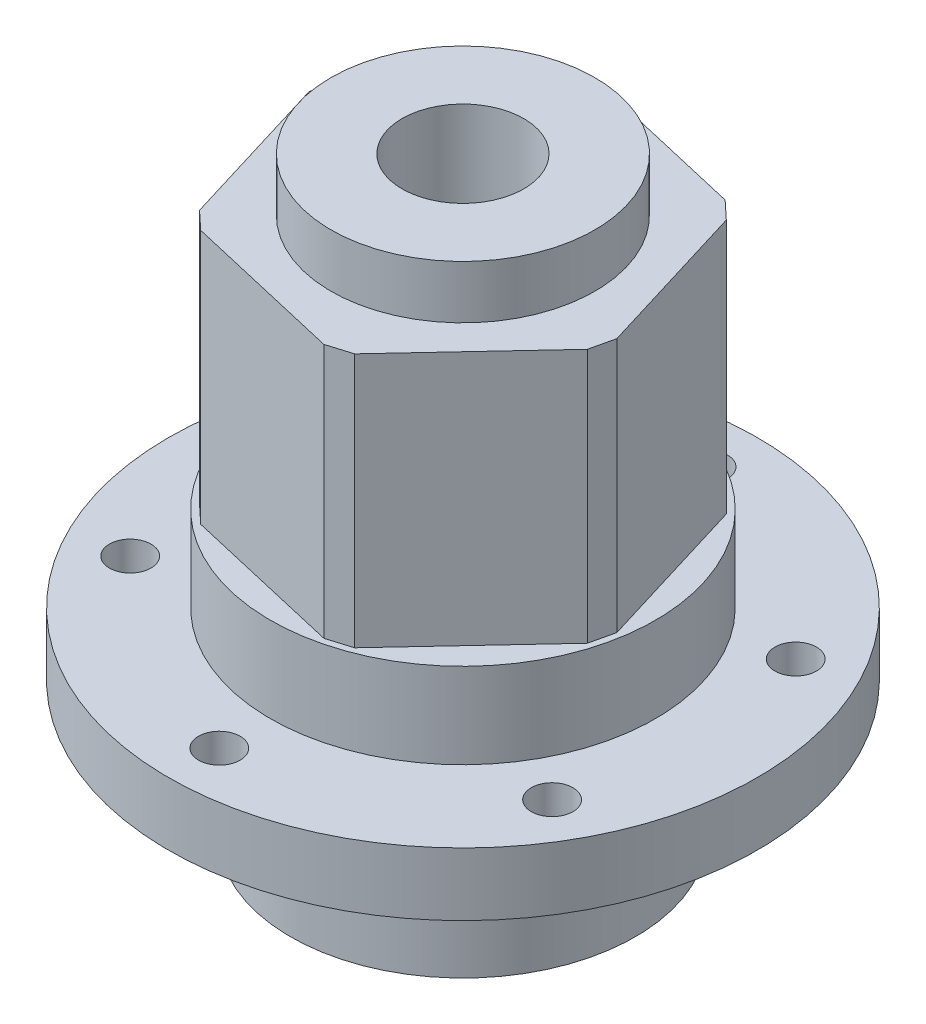
ISO-10303-21;
HEADER;
FILE_DESCRIPTION(('STEP AP214'),'2;1');
FILE_NAME('part.step','',(''),(''),'','','');
FILE_SCHEMA(('AUTOMOTIVE_DESIGN { 1 0 10303 214 1 1 1 1 }'));
ENDSEC;
DATA;
#1=APPLICATION_CONTEXT('core data for automotive mechanical design processes');
#2=APPLICATION_PROTOCOL_DEFINITION('international standard','automotive_design',2000,#1);
#3=PRODUCT_CONTEXT('',#1,'mechanical');
#4=PRODUCT('Part','Part','',(#3));
#5=PRODUCT_RELATED_PRODUCT_CATEGORY('part','',(#4));
#6=PRODUCT_DEFINITION_FORMATION('','',#4);
#7=PRODUCT_DEFINITION_CONTEXT('part definition',#1,'design');
#8=PRODUCT_DEFINITION('design','',#6,#7);
#9=PRODUCT_DEFINITION_SHAPE('','',#8);
#10=(LENGTH_UNIT() NAMED_UNIT(*) SI_UNIT(.MILLI.,.METRE.));
#11=(NAMED_UNIT(*) PLANE_ANGLE_UNIT() SI_UNIT($,.RADIAN.));
#12=(NAMED_UNIT(*) SI_UNIT($,.STERADIAN.) SOLID_ANGLE_UNIT());
#13=UNCERTAINTY_MEASURE_WITH_UNIT(LENGTH_MEASURE(1.E-05),#10,'distance_accuracy_value','');
#14=(GEOMETRIC_REPRESENTATION_CONTEXT(3) GLOBAL_UNCERTAINTY_ASSIGNED_CONTEXT((#13)) GLOBAL_UNIT_ASSIGNED_CONTEXT((#10,
#11,#12)) REPRESENTATION_CONTEXT('',''));
#15=CARTESIAN_POINT('',(0.,0.,0.));
#16=DIRECTION('',(0.,0.,1.));
#17=DIRECTION('',(1.,0.,0.));
#18=AXIS2_PLACEMENT_3D('',#15,#16,#17);
#19=CARTESIAN_POINT('',(0.,12.54,0.));
#20=DIRECTION('',(0.,1.,0.));
#21=DIRECTION('',(-1.,0.,0.));
#22=AXIS2_PLACEMENT_3D('',#19,#20,#21);
#23=PLANE('',#22);
#24=DIRECTION('',(0.974166380961988,0.,0.225831490725767));
#25=VECTOR('',#24,1.);
#26=CARTESIAN_POINT('',(-5.80945991496112,12.54,7.10663100512281));
#27=LINE('',#26,#25);
#28=CARTESIAN_POINT('',(-5.80945991496112,12.54,7.10663100512281));
#29=VERTEX_POINT('',#28);
#30=CARTESIAN_POINT('',(2.09001526270772,12.54,8.93788928932114));
#31=VERTEX_POINT('',#30);
#32=EDGE_CURVE('E133',#29,#31,#27,.T.);
#33=ORIENTED_EDGE('',*,*,#32,.T.);
#34=DIRECTION('',(0.956568578788715,0.,-0.29150738253797));
#35=VECTOR('',#34,1.);
#36=CARTESIAN_POINT('',(2.09001526270772,12.54,8.93788928932114));
#37=LINE('',#36,#35);
#38=CARTESIAN_POINT('',(3.24979302827793,12.54,8.58445537118511));
#39=VERTEX_POINT('',#38);
#40=EDGE_CURVE('E122',#31,#39,#37,.T.);
#41=ORIENTED_EDGE('',*,*,#40,.T.);
#42=DIRECTION('',(0.682658998424018,0.,-0.730737088062948));
#43=VECTOR('',#42,1.);
#44=CARTESIAN_POINT('',(3.24979302827793,12.54,8.58445537118511));
#45=LINE('',#44,#43);
#46=CARTESIAN_POINT('',(8.78544681211881,12.54,2.65893833285847));
#47=VERTEX_POINT('',#46);
#48=EDGE_CURVE('E132',#39,#47,#45,.T.);
#49=ORIENTED_EDGE('',*,*,#48,.T.);
#50=DIRECTION('',(0.225831490725767,0.,-0.974166380961988));
#51=VECTOR('',#50,1.);
#52=CARTESIAN_POINT('',(8.78544681211881,12.54,2.65893833285847));
#53=LINE('',#52,#51);
#54=CARTESIAN_POINT('',(9.05925294323905,12.54,1.4778243660623));
#55=VERTEX_POINT('',#54);
#56=EDGE_CURVE('E529',#47,#55,#53,.T.);
#57=ORIENTED_EDGE('',*,*,#56,.T.);
#58=DIRECTION('',(-0.29150738253797,0.,-0.956568578788715));
#59=VECTOR('',#58,1.);
#60=CARTESIAN_POINT('',(9.05925294323905,12.54,1.4778243660623));
#61=LINE('',#60,#59);
#62=CARTESIAN_POINT('',(6.69543154941108,12.54,-6.27895095646267));
#63=VERTEX_POINT('',#62);
#64=EDGE_CURVE('E531',#55,#63,#61,.T.);
#65=ORIENTED_EDGE('',*,*,#64,.T.);
#66=DIRECTION('',(-0.730737088062948,0.,-0.682658998424018));
#67=VECTOR('',#66,1.);
#68=CARTESIAN_POINT('',(6.69543154941108,12.54,-6.27895095646267));
#69=LINE('',#68,#67);
#70=CARTESIAN_POINT('',(5.80945991496111,12.54,-7.10663100512281));
#71=VERTEX_POINT('',#70);
#72=EDGE_CURVE('E533',#63,#71,#69,.T.);
#73=ORIENTED_EDGE('',*,*,#72,.T.);
#74=DIRECTION('',(-0.974166380961988,0.,-0.225831490725767));
#75=VECTOR('',#74,1.);
#76=CARTESIAN_POINT('',(5.80945991496111,12.54,-7.10663100512281));
#77=LINE('',#76,#75);
#78=CARTESIAN_POINT('',(-2.09001526270773,12.54,-8.93788928932114));
#79=VERTEX_POINT('',#78);
#80=EDGE_CURVE('E535',#71,#79,#77,.T.);
#81=ORIENTED_EDGE('',*,*,#80,.T.);
#82=DIRECTION('',(-0.956568578788715,0.,0.29150738253797));
#83=VECTOR('',#82,1.);
#84=CARTESIAN_POINT('',(-2.09001526270773,12.54,-8.93788928932114));
#85=LINE('',#84,#83);
#86=CARTESIAN_POINT('',(-3.24979302827794,12.54,-8.58445537118511));
#87=VERTEX_POINT('',#86);
#88=EDGE_CURVE('E537',#79,#87,#85,.T.);
#89=ORIENTED_EDGE('',*,*,#88,.T.);
#90=DIRECTION('',(-0.682658998424018,0.,0.730737088062948));
#91=VECTOR('',#90,1.);
#92=CARTESIAN_POINT('',(-3.24979302827794,12.54,-8.58445537118511));
#93=LINE('',#92,#91);
#94=CARTESIAN_POINT('',(-8.78544681211882,12.54,-2.65893833285846));
#95=VERTEX_POINT('',#94);
#96=EDGE_CURVE('E539',#87,#95,#93,.T.);
#97=ORIENTED_EDGE('',*,*,#96,.T.);
#98=DIRECTION('',(-0.225831490725767,0.,0.974166380961988));
#99=VECTOR('',#98,1.);
#100=CARTESIAN_POINT('',(-8.78544681211882,12.54,-2.65893833285846));
#101=LINE('',#100,#99);
#102=CARTESIAN_POINT('',(-9.05925294323905,12.54,-1.4778243660623));
#103=VERTEX_POINT('',#102);
#104=EDGE_CURVE('E541',#95,#103,#101,.T.);
#105=ORIENTED_EDGE('',*,*,#104,.T.);
#106=DIRECTION('',(0.29150738253797,0.,0.956568578788715));
#107=VECTOR('',#106,1.);
#108=CARTESIAN_POINT('',(-9.05925294323905,12.54,-1.4778243660623));
#109=LINE('',#108,#107);
#110=CARTESIAN_POINT('',(-6.69543154941109,12.54,6.27895095646267));
#111=VERTEX_POINT('',#110);
#112=EDGE_CURVE('E543',#103,#111,#109,.T.);
#113=ORIENTED_EDGE('',*,*,#112,.T.);
#114=DIRECTION('',(0.730737088062948,0.,0.682658998424018));
#115=VECTOR('',#114,1.);
#116=CARTESIAN_POINT('',(-6.69543154941109,12.54,6.27895095646267));
#117=LINE('',#116,#115);
#118=EDGE_CURVE('E138',#111,#29,#117,.T.);
#119=ORIENTED_EDGE('',*,*,#118,.T.);
#120=EDGE_LOOP('',(#33,#41,#49,#57,#65,#73,#81,#89,#97,#105,#113,#119));
#121=FACE_BOUND('',#120,.T.);
#122=CARTESIAN_POINT('',(0.,12.54,0.));
#123=DIRECTION('',(0.,1.,0.));
#124=DIRECTION('',(-1.,0.,0.));
#125=AXIS2_PLACEMENT_3D('',#122,#123,#124);
#126=CIRCLE('',#125,6.5);
#127=CARTESIAN_POINT('',(-6.5,12.54,0.));
#128=VERTEX_POINT('',#127);
#129=EDGE_CURVE('E520',#128,#128,#126,.T.);
#130=ORIENTED_EDGE('',*,*,#129,.F.);
#131=EDGE_LOOP('',(#130));
#132=FACE_BOUND('',#131,.T.);
#133=ADVANCED_FACE('F36',(#121,#132),#23,.T.);
#134=CARTESIAN_POINT('',(0.,0.,0.));
#135=DIRECTION('',(0.,-1.,0.));
#136=DIRECTION('',(1.,0.,0.));
#137=AXIS2_PLACEMENT_3D('',#134,#135,#136);
#138=PLANE('',#137);
#139=CARTESIAN_POINT('',(0.,0.,0.));
#140=DIRECTION('',(0.,1.,0.));
#141=DIRECTION('',(-1.,0.,0.));
#142=AXIS2_PLACEMENT_3D('',#139,#140,#141);
#143=CIRCLE('',#142,9.485);
#144=CARTESIAN_POINT('',(-9.485,0.,0.));
#145=VERTEX_POINT('',#144);
#146=EDGE_CURVE('E146',#145,#145,#143,.T.);
#147=ORIENTED_EDGE('',*,*,#146,.T.);
#148=EDGE_LOOP('',(#147));
#149=FACE_BOUND('',#148,.T.);
#150=DIRECTION('',(0.974166380961988,0.,0.225831490725767));
#151=VECTOR('',#150,1.);
#152=CARTESIAN_POINT('',(-5.80945991496112,0.,7.10663100512281));
#153=LINE('',#152,#151);
#154=CARTESIAN_POINT('',(-5.80945991496112,0.,7.10663100512281));
#155=VERTEX_POINT('',#154);
#156=CARTESIAN_POINT('',(2.09001526270772,0.,8.93788928932114));
#157=VERTEX_POINT('',#156);
#158=EDGE_CURVE('E145',#155,#157,#153,.T.);
#159=ORIENTED_EDGE('',*,*,#158,.F.);
#160=DIRECTION('',(0.730737088062948,0.,0.682658998424018));
#161=VECTOR('',#160,1.);
#162=CARTESIAN_POINT('',(-6.69543154941109,0.,6.27895095646267));
#163=LINE('',#162,#161);
#164=CARTESIAN_POINT('',(-6.69543154941109,0.,6.27895095646267));
#165=VERTEX_POINT('',#164);
#166=EDGE_CURVE('E142',#165,#155,#163,.T.);
#167=ORIENTED_EDGE('',*,*,#166,.F.);
#168=DIRECTION('',(0.29150738253797,0.,0.956568578788715));
#169=VECTOR('',#168,1.);
#170=CARTESIAN_POINT('',(-9.05925294323905,0.,-1.4778243660623));
#171=LINE('',#170,#169);
#172=CARTESIAN_POINT('',(-9.05925294323905,0.,-1.4778243660623));
#173=VERTEX_POINT('',#172);
#174=EDGE_CURVE('E571',#173,#165,#171,.T.);
#175=ORIENTED_EDGE('',*,*,#174,.F.);
#176=DIRECTION('',(-0.225831490725767,0.,0.974166380961988));
#177=VECTOR('',#176,1.);
#178=CARTESIAN_POINT('',(-8.78544681211882,0.,-2.65893833285846));
#179=LINE('',#178,#177);
#180=CARTESIAN_POINT('',(-8.78544681211882,0.,-2.65893833285846));
#181=VERTEX_POINT('',#180);
#182=EDGE_CURVE('E568',#181,#173,#179,.T.);
#183=ORIENTED_EDGE('',*,*,#182,.F.);
#184=DIRECTION('',(-0.682658998424018,0.,0.730737088062948));
#185=VECTOR('',#184,1.);
#186=CARTESIAN_POINT('',(-3.24979302827793,0.,-8.58445537118511));
#187=LINE('',#186,#185);
#188=CARTESIAN_POINT('',(-3.24979302827793,0.,-8.58445537118511));
#189=VERTEX_POINT('',#188);
#190=EDGE_CURVE('E565',#189,#181,#187,.T.);
#191=ORIENTED_EDGE('',*,*,#190,.F.);
#192=DIRECTION('',(-0.956568578788715,0.,0.29150738253797));
#193=VECTOR('',#192,1.);
#194=CARTESIAN_POINT('',(-2.09001526270773,0.,-8.93788928932114));
#195=LINE('',#194,#193);
#196=CARTESIAN_POINT('',(-2.09001526270773,0.,-8.93788928932115));
#197=VERTEX_POINT('',#196);
#198=EDGE_CURVE('E562',#197,#189,#195,.T.);
#199=ORIENTED_EDGE('',*,*,#198,.F.);
#200=DIRECTION('',(-0.974166380961988,0.,-0.225831490725767));
#201=VECTOR('',#200,1.);
#202=CARTESIAN_POINT('',(5.80945991496111,0.,-7.10663100512281));
#203=LINE('',#202,#201);
#204=CARTESIAN_POINT('',(5.80945991496111,0.,-7.10663100512281));
#205=VERTEX_POINT('',#204);
#206=EDGE_CURVE('E559',#205,#197,#203,.T.);
#207=ORIENTED_EDGE('',*,*,#206,.F.);
#208=DIRECTION('',(-0.730737088062948,0.,-0.682658998424018));
#209=VECTOR('',#208,1.);
#210=CARTESIAN_POINT('',(6.69543154941108,0.,-6.27895095646267));
#211=LINE('',#210,#209);
#212=CARTESIAN_POINT('',(6.69543154941108,0.,-6.27895095646267));
#213=VERTEX_POINT('',#212);
#214=EDGE_CURVE('E556',#213,#205,#211,.T.);
#215=ORIENTED_EDGE('',*,*,#214,.F.);
#216=DIRECTION('',(-0.29150738253797,0.,-0.956568578788715));
#217=VECTOR('',#216,1.);
#218=CARTESIAN_POINT('',(9.05925294323905,0.,1.4778243660623));
#219=LINE('',#218,#217);
#220=CARTESIAN_POINT('',(9.05925294323905,0.,1.4778243660623));
#221=VERTEX_POINT('',#220);
#222=EDGE_CURVE('E553',#221,#213,#219,.T.);
#223=ORIENTED_EDGE('',*,*,#222,.F.);
#224=DIRECTION('',(0.225831490725767,0.,-0.974166380961988));
#225=VECTOR('',#224,1.);
#226=CARTESIAN_POINT('',(8.78544681211881,0.,2.65893833285847));
#227=LINE('',#226,#225);
#228=CARTESIAN_POINT('',(8.78544681211881,0.,2.65893833285847));
#229=VERTEX_POINT('',#228);
#230=EDGE_CURVE('E550',#229,#221,#227,.T.);
#231=ORIENTED_EDGE('',*,*,#230,.F.);
#232=DIRECTION('',(0.682658998424018,0.,-0.730737088062948));
#233=VECTOR('',#232,1.);
#234=CARTESIAN_POINT('',(3.24979302827793,0.,8.58445537118511));
#235=LINE('',#234,#233);
#236=CARTESIAN_POINT('',(3.24979302827793,0.,8.58445537118511));
#237=VERTEX_POINT('',#236);
#238=EDGE_CURVE('E56',#237,#229,#235,.T.);
#239=ORIENTED_EDGE('',*,*,#238,.F.);
#240=DIRECTION('',(0.956568578788715,0.,-0.29150738253797));
#241=VECTOR('',#240,1.);
#242=CARTESIAN_POINT('',(2.09001526270773,0.,8.93788928932114));
#243=LINE('',#242,#241);
#244=EDGE_CURVE('E51',#157,#237,#243,.T.);
#245=ORIENTED_EDGE('',*,*,#244,.F.);
#246=EDGE_LOOP('',(#159,#167,#175,#183,#191,#199,#207,#215,#223,#231,#239,#245));
#247=FACE_BOUND('',#246,.T.);
#248=ADVANCED_FACE('F176',(#149,#247),#138,.F.);
#249=CARTESIAN_POINT('',(8.495,-14.,0.));
#250=DIRECTION('',(0.,1.,0.));
#251=DIRECTION('',(-1.,0.,0.));
#252=AXIS2_PLACEMENT_3D('',#249,#250,#251);
#253=PLANE('',#252);
#254=CARTESIAN_POINT('',(0.,-14.,0.));
#255=DIRECTION('',(0.,1.,0.));
#256=DIRECTION('',(-1.,0.,0.));
#257=AXIS2_PLACEMENT_3D('',#254,#255,#256);
#258=CIRCLE('',#257,3.);
#259=CARTESIAN_POINT('',(-3.,-14.,0.));
#260=VERTEX_POINT('',#259);
#261=EDGE_CURVE('E518',#260,#260,#258,.T.);
#262=ORIENTED_EDGE('',*,*,#261,.T.);
#263=EDGE_LOOP('',(#262));
#264=FACE_BOUND('',#263,.T.);
#265=CARTESIAN_POINT('',(0.,-14.,0.));
#266=DIRECTION('',(0.,1.,0.));
#267=DIRECTION('',(-1.,0.,0.));
#268=AXIS2_PLACEMENT_3D('',#265,#266,#267);
#269=CIRCLE('',#268,8.495);
#270=CARTESIAN_POINT('',(-8.495,-14.,0.));
#271=VERTEX_POINT('',#270);
#272=EDGE_CURVE('E11',#271,#271,#269,.T.);
#273=ORIENTED_EDGE('',*,*,#272,.F.);
#274=EDGE_LOOP('',(#273));
#275=FACE_BOUND('',#274,.T.);
#276=ADVANCED_FACE('F38',(#264,#275),#253,.F.);
#277=CARTESIAN_POINT('',(0.,0.,0.));
#278=DIRECTION('',(0.,1.,0.));
#279=DIRECTION('',(-1.,0.,0.));
#280=AXIS2_PLACEMENT_3D('',#277,#278,#279);
#281=CYLINDRICAL_SURFACE('',#280,8.495);
#282=CARTESIAN_POINT('',(0.,-9.55000000000002,0.));
#283=DIRECTION('',(0.,1.,0.));
#284=DIRECTION('',(-1.,0.,0.));
#285=AXIS2_PLACEMENT_3D('',#282,#283,#284);
#286=CIRCLE('',#285,8.495);
#287=CARTESIAN_POINT('',(-8.495,-9.55000000000002,0.));
#288=VERTEX_POINT('',#287);
#289=EDGE_CURVE('E44',#288,#288,#286,.T.);
#290=ORIENTED_EDGE('',*,*,#289,.F.);
#291=EDGE_LOOP('',(#290));
#292=FACE_BOUND('',#291,.T.);
#293=ORIENTED_EDGE('',*,*,#272,.T.);
#294=EDGE_LOOP('',(#293));
#295=FACE_BOUND('',#294,.T.);
#296=ADVANCED_FACE('F170',(#292,#295),#281,.T.);
#297=CARTESIAN_POINT('',(0.,-9.55,0.));
#298=DIRECTION('',(0.,1.,0.));
#299=DIRECTION('',(-1.,0.,0.));
#300=AXIS2_PLACEMENT_3D('',#297,#298,#299);
#301=TOROIDAL_SURFACE('',#300,10.745,2.25);
#302=CARTESIAN_POINT('',(0.,-7.3,0.));
#303=DIRECTION('',(0.,1.,0.));
#304=DIRECTION('',(-1.,0.,0.));
#305=AXIS2_PLACEMENT_3D('',#302,#303,#304);
#306=CIRCLE('',#305,10.745);
#307=CARTESIAN_POINT('',(-10.745,-7.3,0.));
#308=VERTEX_POINT('',#307);
#309=EDGE_CURVE('E163',#308,#308,#306,.T.);
#310=ORIENTED_EDGE('',*,*,#309,.F.);
#311=EDGE_LOOP('',(#310));
#312=FACE_BOUND('',#311,.T.);
#313=ORIENTED_EDGE('',*,*,#289,.T.);
#314=EDGE_LOOP('',(#313));
#315=FACE_BOUND('',#314,.T.);
#316=ADVANCED_FACE('F168',(#312,#315),#301,.F.);
#317=CARTESIAN_POINT('',(14.505,-7.3,0.));
#318=DIRECTION('',(0.,1.,0.));
#319=DIRECTION('',(-1.,0.,0.));
#320=AXIS2_PLACEMENT_3D('',#317,#318,#319);
#321=PLANE('',#320);
#322=CARTESIAN_POINT('',(0.,-7.3,12.));
#323=DIRECTION('',(0.,1.,0.));
#324=DIRECTION('',(-1.,0.,0.));
#325=AXIS2_PLACEMENT_3D('',#322,#323,#324);
#326=CIRCLE('',#325,1.02499999999999);
#327=CARTESIAN_POINT('',(-1.02499999999999,-7.3,12.));
#328=VERTEX_POINT('',#327);
#329=EDGE_CURVE('E483',#328,#328,#326,.T.);
#330=ORIENTED_EDGE('',*,*,#329,.T.);
#331=EDGE_LOOP('',(#330));
#332=FACE_BOUND('',#331,.T.);
#333=CARTESIAN_POINT('',(-10.3923048454133,-7.3,5.99999999999998));
#334=DIRECTION('',(0.,1.,0.));
#335=DIRECTION('',(-1.,0.,0.));
#336=AXIS2_PLACEMENT_3D('',#333,#334,#335);
#337=CIRCLE('',#336,1.02499999999999);
#338=CARTESIAN_POINT('',(-11.4173048454133,-7.3,5.99999999999998));
#339=VERTEX_POINT('',#338);
#340=EDGE_CURVE('E487',#339,#339,#337,.T.);
#341=ORIENTED_EDGE('',*,*,#340,.T.);
#342=EDGE_LOOP('',(#341));
#343=FACE_BOUND('',#342,.T.);
#344=CARTESIAN_POINT('',(-10.3923048454132,-7.3,-6.00000000000005));
#345=DIRECTION('',(0.,1.,0.));
#346=DIRECTION('',(-1.,0.,0.));
#347=AXIS2_PLACEMENT_3D('',#344,#345,#346);
#348=CIRCLE('',#347,1.02499999999999);
#349=CARTESIAN_POINT('',(-11.4173048454132,-7.3,-6.00000000000005));
#350=VERTEX_POINT('',#349);
#351=EDGE_CURVE('E496',#350,#350,#348,.T.);
#352=ORIENTED_EDGE('',*,*,#351,.T.);
#353=EDGE_LOOP('',(#352));
#354=FACE_BOUND('',#353,.T.);
#355=CARTESIAN_POINT('',(0.,-7.3,-12.));
#356=DIRECTION('',(0.,1.,0.));
#357=DIRECTION('',(-1.,0.,0.));
#358=AXIS2_PLACEMENT_3D('',#355,#356,#357);
#359=CIRCLE('',#358,1.02499999999999);
#360=CARTESIAN_POINT('',(-1.02499999999991,-7.3,-12.));
#361=VERTEX_POINT('',#360);
#362=EDGE_CURVE('E502',#361,#361,#359,.T.);
#363=ORIENTED_EDGE('',*,*,#362,.T.);
#364=EDGE_LOOP('',(#363));
#365=FACE_BOUND('',#364,.T.);
#366=CARTESIAN_POINT('',(10.3923048454133,-7.3,-5.9999999999999));
#367=DIRECTION('',(0.,1.,0.));
#368=DIRECTION('',(-1.,0.,0.));
#369=AXIS2_PLACEMENT_3D('',#366,#367,#368);
#370=CIRCLE('',#369,1.02499999999999);
#371=CARTESIAN_POINT('',(9.36730484541333,-7.3,-5.9999999999999));
#372=VERTEX_POINT('',#371);
#373=EDGE_CURVE('E508',#372,#372,#370,.T.);
#374=ORIENTED_EDGE('',*,*,#373,.T.);
#375=EDGE_LOOP('',(#374));
#376=FACE_BOUND('',#375,.T.);
#377=CARTESIAN_POINT('',(10.3923048454132,-7.3,6.00000000000012));
#378=DIRECTION('',(0.,1.,0.));
#379=DIRECTION('',(-1.,0.,0.));
#380=AXIS2_PLACEMENT_3D('',#377,#378,#379);
#381=CIRCLE('',#380,1.02499999999999);
#382=CARTESIAN_POINT('',(9.3673048454132,-7.3,6.00000000000012));
#383=VERTEX_POINT('',#382);
#384=EDGE_CURVE('E514',#383,#383,#381,.T.);
#385=ORIENTED_EDGE('',*,*,#384,.T.);
#386=EDGE_LOOP('',(#385));
#387=FACE_BOUND('',#386,.T.);
#388=CARTESIAN_POINT('',(0.,-7.3,0.));
#389=DIRECTION('',(0.,1.,0.));
#390=DIRECTION('',(-1.,0.,0.));
#391=AXIS2_PLACEMENT_3D('',#388,#389,#390);
#392=CIRCLE('',#391,14.505);
#393=CARTESIAN_POINT('',(-14.505,-7.3,0.));
#394=VERTEX_POINT('',#393);
#395=EDGE_CURVE('E160',#394,#394,#392,.T.);
#396=ORIENTED_EDGE('',*,*,#395,.F.);
#397=EDGE_LOOP('',(#396));
#398=FACE_BOUND('',#397,.T.);
#399=ORIENTED_EDGE('',*,*,#309,.T.);
#400=EDGE_LOOP('',(#399));
#401=FACE_BOUND('',#400,.T.);
#402=ADVANCED_FACE('F247',(#332,#343,#354,#365,#376,#387,#398,#401),#321,.F.);
#403=CARTESIAN_POINT('',(0.,0.,0.));
#404=DIRECTION('',(0.,1.,0.));
#405=DIRECTION('',(-1.,0.,0.));
#406=AXIS2_PLACEMENT_3D('',#403,#404,#405);
#407=CYLINDRICAL_SURFACE('',#406,14.505);
#408=CARTESIAN_POINT('',(0.,-4.2,0.));
#409=DIRECTION('',(0.,1.,0.));
#410=DIRECTION('',(-1.,0.,0.));
#411=AXIS2_PLACEMENT_3D('',#408,#409,#410);
#412=CIRCLE('',#411,14.505);
#413=CARTESIAN_POINT('',(-14.505,-4.2,0.));
#414=VERTEX_POINT('',#413);
#415=EDGE_CURVE('E157',#414,#414,#412,.T.);
#416=ORIENTED_EDGE('',*,*,#415,.F.);
#417=EDGE_LOOP('',(#416));
#418=FACE_BOUND('',#417,.T.);
#419=ORIENTED_EDGE('',*,*,#395,.T.);
#420=EDGE_LOOP('',(#419));
#421=FACE_BOUND('',#420,.T.);
#422=ADVANCED_FACE('F243',(#418,#421),#407,.T.);
#423=CARTESIAN_POINT('',(9.485,-4.2,0.));
#424=DIRECTION('',(0.,-1.,0.));
#425=DIRECTION('',(1.,0.,0.));
#426=AXIS2_PLACEMENT_3D('',#423,#424,#425);
#427=PLANE('',#426);
#428=CARTESIAN_POINT('',(0.,-4.2,12.));
#429=DIRECTION('',(0.,1.,0.));
#430=DIRECTION('',(0.,0.,1.));
#431=AXIS2_PLACEMENT_3D('',#428,#429,#430);
#432=CIRCLE('',#431,1.02499999999999);
#433=CARTESIAN_POINT('',(0.,-4.2,13.025));
#434=VERTEX_POINT('',#433);
#435=EDGE_CURVE('E480',#434,#434,#432,.T.);
#436=ORIENTED_EDGE('',*,*,#435,.F.);
#437=EDGE_LOOP('',(#436));
#438=FACE_BOUND('',#437,.T.);
#439=CARTESIAN_POINT('',(-10.3923048454133,-4.2,5.99999999999998));
#440=DIRECTION('',(0.,1.,0.));
#441=DIRECTION('',(0.,0.,1.));
#442=AXIS2_PLACEMENT_3D('',#439,#440,#441);
#443=CIRCLE('',#442,1.02499999999999);
#444=CARTESIAN_POINT('',(-10.3923048454133,-4.2,7.02499999999996));
#445=VERTEX_POINT('',#444);
#446=EDGE_CURVE('E484',#445,#445,#443,.T.);
#447=ORIENTED_EDGE('',*,*,#446,.F.);
#448=EDGE_LOOP('',(#447));
#449=FACE_BOUND('',#448,.T.);
#450=CARTESIAN_POINT('',(-10.3923048454132,-4.2,-6.00000000000005));
#451=DIRECTION('',(0.,1.,0.));
#452=DIRECTION('',(0.,0.,1.));
#453=AXIS2_PLACEMENT_3D('',#450,#451,#452);
#454=CIRCLE('',#453,1.02499999999999);
#455=CARTESIAN_POINT('',(-10.3923048454132,-4.2,-4.97500000000006));
#456=VERTEX_POINT('',#455);
#457=EDGE_CURVE('E493',#456,#456,#454,.T.);
#458=ORIENTED_EDGE('',*,*,#457,.F.);
#459=EDGE_LOOP('',(#458));
#460=FACE_BOUND('',#459,.T.);
#461=CARTESIAN_POINT('',(0.,-4.2,-12.));
#462=DIRECTION('',(0.,1.,0.));
#463=DIRECTION('',(0.,0.,1.));
#464=AXIS2_PLACEMENT_3D('',#461,#462,#463);
#465=CIRCLE('',#464,1.02499999999999);
#466=CARTESIAN_POINT('',(0.,-4.2,-10.975));
#467=VERTEX_POINT('',#466);
#468=EDGE_CURVE('E499',#467,#467,#465,.T.);
#469=ORIENTED_EDGE('',*,*,#468,.F.);
#470=EDGE_LOOP('',(#469));
#471=FACE_BOUND('',#470,.T.);
#472=CARTESIAN_POINT('',(10.3923048454133,-4.2,-5.9999999999999));
#473=DIRECTION('',(0.,1.,0.));
#474=DIRECTION('',(0.,0.,1.));
#475=AXIS2_PLACEMENT_3D('',#472,#473,#474);
#476=CIRCLE('',#475,1.02499999999999);
#477=CARTESIAN_POINT('',(10.3923048454133,-4.2,-4.97499999999992));
#478=VERTEX_POINT('',#477);
#479=EDGE_CURVE('E505',#478,#478,#476,.T.);
#480=ORIENTED_EDGE('',*,*,#479,.F.);
#481=EDGE_LOOP('',(#480));
#482=FACE_BOUND('',#481,.T.);
#483=CARTESIAN_POINT('',(10.3923048454132,-4.2,6.00000000000012));
#484=DIRECTION('',(0.,1.,0.));
#485=DIRECTION('',(0.,0.,1.));
#486=AXIS2_PLACEMENT_3D('',#483,#484,#485);
#487=CIRCLE('',#486,1.02499999999999);
#488=CARTESIAN_POINT('',(10.3923048454132,-4.2,7.02500000000011));
#489=VERTEX_POINT('',#488);
#490=EDGE_CURVE('E511',#489,#489,#487,.T.);
#491=ORIENTED_EDGE('',*,*,#490,.F.);
#492=EDGE_LOOP('',(#491));
#493=FACE_BOUND('',#492,.T.);
#494=CARTESIAN_POINT('',(0.,-4.2,0.));
#495=DIRECTION('',(0.,1.,0.));
#496=DIRECTION('',(-1.,0.,0.));
#497=AXIS2_PLACEMENT_3D('',#494,#495,#496);
#498=CIRCLE('',#497,9.485);
#499=CARTESIAN_POINT('',(-9.485,-4.2,0.));
#500=VERTEX_POINT('',#499);
#501=EDGE_CURVE('E149',#500,#500,#498,.T.);
#502=ORIENTED_EDGE('',*,*,#501,.F.);
#503=EDGE_LOOP('',(#502));
#504=FACE_BOUND('',#503,.T.);
#505=ORIENTED_EDGE('',*,*,#415,.T.);
#506=EDGE_LOOP('',(#505));
#507=FACE_BOUND('',#506,.T.);
#508=ADVANCED_FACE('F239',(#438,#449,#460,#471,#482,#493,#504,#507),#427,.F.);
#509=CARTESIAN_POINT('',(0.,0.,0.));
#510=DIRECTION('',(0.,1.,0.));
#511=DIRECTION('',(-1.,0.,0.));
#512=AXIS2_PLACEMENT_3D('',#509,#510,#511);
#513=CYLINDRICAL_SURFACE('',#512,9.485);
#514=ORIENTED_EDGE('',*,*,#146,.F.);
#515=EDGE_LOOP('',(#514));
#516=FACE_BOUND('',#515,.T.);
#517=ORIENTED_EDGE('',*,*,#501,.T.);
#518=EDGE_LOOP('',(#517));
#519=FACE_BOUND('',#518,.T.);
#520=ADVANCED_FACE('F235',(#516,#519),#513,.T.);
#521=CARTESIAN_POINT('',(-5.80945991496112,12.54,7.10663100512281));
#522=DIRECTION('',(0.225831490725767,0.,-0.974166380961988));
#523=DIRECTION('',(-0.974166380961988,0.,-0.225831490725767));
#524=AXIS2_PLACEMENT_3D('',#521,#522,#523);
#525=PLANE('',#524);
#526=ORIENTED_EDGE('',*,*,#158,.T.);
#527=DIRECTION('',(0.,-1.,0.));
#528=VECTOR('',#527,1.);
#529=CARTESIAN_POINT('',(2.09001526270772,12.54,8.93788928932114));
#530=LINE('',#529,#528);
#531=EDGE_CURVE('E126',#31,#157,#530,.T.);
#532=ORIENTED_EDGE('',*,*,#531,.F.);
#533=ORIENTED_EDGE('',*,*,#32,.F.);
#534=DIRECTION('',(0.,-1.,0.));
#535=VECTOR('',#534,1.);
#536=CARTESIAN_POINT('',(-5.80945991496112,12.54,7.10663100512281));
#537=LINE('',#536,#535);
#538=EDGE_CURVE('E546',#29,#155,#537,.T.);
#539=ORIENTED_EDGE('',*,*,#538,.T.);
#540=EDGE_LOOP('',(#526,#532,#533,#539));
#541=FACE_BOUND('',#540,.T.);
#542=ADVANCED_FACE('F144',(#541),#525,.F.);
#543=CARTESIAN_POINT('',(2.09001526270772,12.54,8.93788928932114));
#544=DIRECTION('',(-0.29150738253797,0.,-0.956568578788715));
#545=DIRECTION('',(-0.956568578788715,0.,0.29150738253797));
#546=AXIS2_PLACEMENT_3D('',#543,#544,#545);
#547=PLANE('',#546);
#548=ORIENTED_EDGE('',*,*,#244,.T.);
#549=DIRECTION('',(0.,-1.,0.));
#550=VECTOR('',#549,1.);
#551=CARTESIAN_POINT('',(3.24979302827793,12.54,8.58445537118511));
#552=LINE('',#551,#550);
#553=EDGE_CURVE('E129',#39,#237,#552,.T.);
#554=ORIENTED_EDGE('',*,*,#553,.F.);
#555=ORIENTED_EDGE('',*,*,#40,.F.);
#556=ORIENTED_EDGE('',*,*,#531,.T.);
#557=EDGE_LOOP('',(#548,#554,#555,#556));
#558=FACE_BOUND('',#557,.T.);
#559=ADVANCED_FACE('F124',(#558),#547,.F.);
#560=CARTESIAN_POINT('',(3.24979302827793,12.54,8.58445537118511));
#561=DIRECTION('',(-0.730737088062948,0.,-0.682658998424018));
#562=DIRECTION('',(-0.682658998424018,0.,0.730737088062948));
#563=AXIS2_PLACEMENT_3D('',#560,#561,#562);
#564=PLANE('',#563);
#565=ORIENTED_EDGE('',*,*,#238,.T.);
#566=DIRECTION('',(0.,-1.,0.));
#567=VECTOR('',#566,1.);
#568=CARTESIAN_POINT('',(8.78544681211881,12.54,2.65893833285847));
#569=LINE('',#568,#567);
#570=EDGE_CURVE('E151',#47,#229,#569,.T.);
#571=ORIENTED_EDGE('',*,*,#570,.F.);
#572=ORIENTED_EDGE('',*,*,#48,.F.);
#573=ORIENTED_EDGE('',*,*,#553,.T.);
#574=EDGE_LOOP('',(#565,#571,#572,#573));
#575=FACE_BOUND('',#574,.T.);
#576=ADVANCED_FACE('F227',(#575),#564,.F.);
#577=CARTESIAN_POINT('',(8.78544681211881,12.54,2.65893833285847));
#578=DIRECTION('',(-0.974166380961988,0.,-0.225831490725767));
#579=DIRECTION('',(-0.225831490725767,0.,0.974166380961988));
#580=AXIS2_PLACEMENT_3D('',#577,#578,#579);
#581=PLANE('',#580);
#582=ORIENTED_EDGE('',*,*,#230,.T.);
#583=DIRECTION('',(0.,-1.,0.));
#584=VECTOR('',#583,1.);
#585=CARTESIAN_POINT('',(9.05925294323905,12.54,1.4778243660623));
#586=LINE('',#585,#584);
#587=EDGE_CURVE('E598',#55,#221,#586,.T.);
#588=ORIENTED_EDGE('',*,*,#587,.F.);
#589=ORIENTED_EDGE('',*,*,#56,.F.);
#590=ORIENTED_EDGE('',*,*,#570,.T.);
#591=EDGE_LOOP('',(#582,#588,#589,#590));
#592=FACE_BOUND('',#591,.T.);
#593=ADVANCED_FACE('F223',(#592),#581,.F.);
#594=CARTESIAN_POINT('',(9.05925294323905,12.54,1.4778243660623));
#595=DIRECTION('',(-0.956568578788715,0.,0.29150738253797));
#596=DIRECTION('',(0.29150738253797,0.,0.956568578788715));
#597=AXIS2_PLACEMENT_3D('',#594,#595,#596);
#598=PLANE('',#597);
#599=ORIENTED_EDGE('',*,*,#222,.T.);
#600=DIRECTION('',(0.,-1.,0.));
#601=VECTOR('',#600,1.);
#602=CARTESIAN_POINT('',(6.69543154941108,12.54,-6.27895095646267));
#603=LINE('',#602,#601);
#604=EDGE_CURVE('E595',#63,#213,#603,.T.);
#605=ORIENTED_EDGE('',*,*,#604,.F.);
#606=ORIENTED_EDGE('',*,*,#64,.F.);
#607=ORIENTED_EDGE('',*,*,#587,.T.);
#608=EDGE_LOOP('',(#599,#605,#606,#607));
#609=FACE_BOUND('',#608,.T.);
#610=ADVANCED_FACE('F219',(#609),#598,.F.);
#611=CARTESIAN_POINT('',(6.69543154941108,12.54,-6.27895095646267));
#612=DIRECTION('',(-0.682658998424018,0.,0.730737088062948));
#613=DIRECTION('',(0.730737088062948,0.,0.682658998424018));
#614=AXIS2_PLACEMENT_3D('',#611,#612,#613);
#615=PLANE('',#614);
#616=ORIENTED_EDGE('',*,*,#214,.T.);
#617=DIRECTION('',(0.,-1.,0.));
#618=VECTOR('',#617,1.);
#619=CARTESIAN_POINT('',(5.80945991496111,12.54,-7.10663100512281));
#620=LINE('',#619,#618);
#621=EDGE_CURVE('E592',#71,#205,#620,.T.);
#622=ORIENTED_EDGE('',*,*,#621,.F.);
#623=ORIENTED_EDGE('',*,*,#72,.F.);
#624=ORIENTED_EDGE('',*,*,#604,.T.);
#625=EDGE_LOOP('',(#616,#622,#623,#624));
#626=FACE_BOUND('',#625,.T.);
#627=ADVANCED_FACE('F215',(#626),#615,.F.);
#628=CARTESIAN_POINT('',(5.80945991496111,12.54,-7.10663100512281));
#629=DIRECTION('',(-0.225831490725767,0.,0.974166380961988));
#630=DIRECTION('',(0.974166380961988,0.,0.225831490725767));
#631=AXIS2_PLACEMENT_3D('',#628,#629,#630);
#632=PLANE('',#631);
#633=ORIENTED_EDGE('',*,*,#206,.T.);
#634=DIRECTION('',(0.,-1.,0.));
#635=VECTOR('',#634,1.);
#636=CARTESIAN_POINT('',(-2.09001526270773,12.54,-8.93788928932114));
#637=LINE('',#636,#635);
#638=EDGE_CURVE('E589',#79,#197,#637,.T.);
#639=ORIENTED_EDGE('',*,*,#638,.F.);
#640=ORIENTED_EDGE('',*,*,#80,.F.);
#641=ORIENTED_EDGE('',*,*,#621,.T.);
#642=EDGE_LOOP('',(#633,#639,#640,#641));
#643=FACE_BOUND('',#642,.T.);
#644=ADVANCED_FACE('F211',(#643),#632,.F.);
#645=CARTESIAN_POINT('',(-2.09001526270773,12.54,-8.93788928932114));
#646=DIRECTION('',(0.29150738253797,0.,0.956568578788715));
#647=DIRECTION('',(0.956568578788715,0.,-0.29150738253797));
#648=AXIS2_PLACEMENT_3D('',#645,#646,#647);
#649=PLANE('',#648);
#650=ORIENTED_EDGE('',*,*,#198,.T.);
#651=DIRECTION('',(0.,-1.,0.));
#652=VECTOR('',#651,1.);
#653=CARTESIAN_POINT('',(-3.24979302827794,12.54,-8.58445537118511));
#654=LINE('',#653,#652);
#655=EDGE_CURVE('E586',#87,#189,#654,.T.);
#656=ORIENTED_EDGE('',*,*,#655,.F.);
#657=ORIENTED_EDGE('',*,*,#88,.F.);
#658=ORIENTED_EDGE('',*,*,#638,.T.);
#659=EDGE_LOOP('',(#650,#656,#657,#658));
#660=FACE_BOUND('',#659,.T.);
#661=ADVANCED_FACE('F207',(#660),#649,.F.);
#662=CARTESIAN_POINT('',(-3.24979302827794,12.54,-8.58445537118511));
#663=DIRECTION('',(0.730737088062948,0.,0.682658998424018));
#664=DIRECTION('',(0.682658998424018,0.,-0.730737088062948));
#665=AXIS2_PLACEMENT_3D('',#662,#663,#664);
#666=PLANE('',#665);
#667=ORIENTED_EDGE('',*,*,#190,.T.);
#668=DIRECTION('',(0.,-1.,0.));
#669=VECTOR('',#668,1.);
#670=CARTESIAN_POINT('',(-8.78544681211882,12.54,-2.65893833285846));
#671=LINE('',#670,#669);
#672=EDGE_CURVE('E583',#95,#181,#671,.T.);
#673=ORIENTED_EDGE('',*,*,#672,.F.);
#674=ORIENTED_EDGE('',*,*,#96,.F.);
#675=ORIENTED_EDGE('',*,*,#655,.T.);
#676=EDGE_LOOP('',(#667,#673,#674,#675));
#677=FACE_BOUND('',#676,.T.);
#678=ADVANCED_FACE('F203',(#677),#666,.F.);
#679=CARTESIAN_POINT('',(-8.78544681211882,12.54,-2.65893833285846));
#680=DIRECTION('',(0.974166380961988,0.,0.225831490725767));
#681=DIRECTION('',(0.225831490725767,0.,-0.974166380961988));
#682=AXIS2_PLACEMENT_3D('',#679,#680,#681);
#683=PLANE('',#682);
#684=ORIENTED_EDGE('',*,*,#182,.T.);
#685=DIRECTION('',(0.,-1.,0.));
#686=VECTOR('',#685,1.);
#687=CARTESIAN_POINT('',(-9.05925294323905,12.54,-1.4778243660623));
#688=LINE('',#687,#686);
#689=EDGE_CURVE('E580',#103,#173,#688,.T.);
#690=ORIENTED_EDGE('',*,*,#689,.F.);
#691=ORIENTED_EDGE('',*,*,#104,.F.);
#692=ORIENTED_EDGE('',*,*,#672,.T.);
#693=EDGE_LOOP('',(#684,#690,#691,#692));
#694=FACE_BOUND('',#693,.T.);
#695=ADVANCED_FACE('F199',(#694),#683,.F.);
#696=CARTESIAN_POINT('',(-9.05925294323905,12.54,-1.4778243660623));
#697=DIRECTION('',(0.956568578788715,0.,-0.29150738253797));
#698=DIRECTION('',(-0.29150738253797,0.,-0.956568578788715));
#699=AXIS2_PLACEMENT_3D('',#696,#697,#698);
#700=PLANE('',#699);
#701=ORIENTED_EDGE('',*,*,#174,.T.);
#702=DIRECTION('',(0.,-1.,0.));
#703=VECTOR('',#702,1.);
#704=CARTESIAN_POINT('',(-6.69543154941109,12.54,6.27895095646267));
#705=LINE('',#704,#703);
#706=EDGE_CURVE('E577',#111,#165,#705,.T.);
#707=ORIENTED_EDGE('',*,*,#706,.F.);
#708=ORIENTED_EDGE('',*,*,#112,.F.);
#709=ORIENTED_EDGE('',*,*,#689,.T.);
#710=EDGE_LOOP('',(#701,#707,#708,#709));
#711=FACE_BOUND('',#710,.T.);
#712=ADVANCED_FACE('F195',(#711),#700,.F.);
#713=CARTESIAN_POINT('',(-6.69543154941109,12.54,6.27895095646267));
#714=DIRECTION('',(0.682658998424018,0.,-0.730737088062948));
#715=DIRECTION('',(-0.730737088062948,0.,-0.682658998424018));
#716=AXIS2_PLACEMENT_3D('',#713,#714,#715);
#717=PLANE('',#716);
#718=ORIENTED_EDGE('',*,*,#166,.T.);
#719=ORIENTED_EDGE('',*,*,#538,.F.);
#720=ORIENTED_EDGE('',*,*,#118,.F.);
#721=ORIENTED_EDGE('',*,*,#706,.T.);
#722=EDGE_LOOP('',(#718,#719,#720,#721));
#723=FACE_BOUND('',#722,.T.);
#724=ADVANCED_FACE('F192',(#723),#717,.F.);
#725=CARTESIAN_POINT('',(0.,15.16,0.));
#726=DIRECTION('',(0.,-1.,0.));
#727=DIRECTION('',(1.,0.,0.));
#728=AXIS2_PLACEMENT_3D('',#725,#726,#727);
#729=CYLINDRICAL_SURFACE('',#728,6.5);
#730=CARTESIAN_POINT('',(0.,15.16,0.));
#731=DIRECTION('',(0.,1.,0.));
#732=DIRECTION('',(-1.,0.,0.));
#733=AXIS2_PLACEMENT_3D('',#730,#731,#732);
#734=CIRCLE('',#733,6.5);
#735=CARTESIAN_POINT('',(-6.5,15.16,0.));
#736=VERTEX_POINT('',#735);
#737=EDGE_CURVE('E523',#736,#736,#734,.T.);
#738=ORIENTED_EDGE('',*,*,#737,.F.);
#739=EDGE_LOOP('',(#738));
#740=FACE_BOUND('',#739,.T.);
#741=ORIENTED_EDGE('',*,*,#129,.T.);
#742=EDGE_LOOP('',(#741));
#743=FACE_BOUND('',#742,.T.);
#744=ADVANCED_FACE('F190',(#740,#743),#729,.T.);
#745=CARTESIAN_POINT('',(0.,15.16,0.));
#746=DIRECTION('',(0.,1.,0.));
#747=DIRECTION('',(-1.,0.,0.));
#748=AXIS2_PLACEMENT_3D('',#745,#746,#747);
#749=PLANE('',#748);
#750=CARTESIAN_POINT('',(0.,15.16,0.));
#751=DIRECTION('',(0.,1.,0.));
#752=DIRECTION('',(-1.,0.,0.));
#753=AXIS2_PLACEMENT_3D('',#750,#751,#752);
#754=CIRCLE('',#753,3.);
#755=CARTESIAN_POINT('',(-3.,15.16,0.));
#756=VERTEX_POINT('',#755);
#757=EDGE_CURVE('E517',#756,#756,#754,.T.);
#758=ORIENTED_EDGE('',*,*,#757,.F.);
#759=EDGE_LOOP('',(#758));
#760=FACE_BOUND('',#759,.T.);
#761=ORIENTED_EDGE('',*,*,#737,.T.);
#762=EDGE_LOOP('',(#761));
#763=FACE_BOUND('',#762,.T.);
#764=ADVANCED_FACE('F333',(#760,#763),#749,.T.);
#765=CARTESIAN_POINT('',(0.,-14.,0.));
#766=DIRECTION('',(0.,1.,0.));
#767=DIRECTION('',(-1.,0.,0.));
#768=AXIS2_PLACEMENT_3D('',#765,#766,#767);
#769=CYLINDRICAL_SURFACE('',#768,3.);
#770=ORIENTED_EDGE('',*,*,#261,.F.);
#771=EDGE_LOOP('',(#770));
#772=FACE_BOUND('',#771,.T.);
#773=ORIENTED_EDGE('',*,*,#757,.T.);
#774=EDGE_LOOP('',(#773));
#775=FACE_BOUND('',#774,.T.);
#776=ADVANCED_FACE('F340',(#772,#775),#769,.F.);
#777=CARTESIAN_POINT('',(10.3923048454132,-4.2,6.00000000000012));
#778=DIRECTION('',(0.,1.,0.));
#779=DIRECTION('',(0.,0.,1.));
#780=AXIS2_PLACEMENT_3D('',#777,#778,#779);
#781=CYLINDRICAL_SURFACE('',#780,1.02499999999999);
#782=ORIENTED_EDGE('',*,*,#490,.T.);
#783=EDGE_LOOP('',(#782));
#784=FACE_BOUND('',#783,.T.);
#785=ORIENTED_EDGE('',*,*,#384,.F.);
#786=EDGE_LOOP('',(#785));
#787=FACE_BOUND('',#786,.T.);
#788=ADVANCED_FACE('F346',(#784,#787),#781,.F.);
#789=CARTESIAN_POINT('',(10.3923048454133,-4.2,-5.9999999999999));
#790=DIRECTION('',(0.,1.,0.));
#791=DIRECTION('',(0.,0.,1.));
#792=AXIS2_PLACEMENT_3D('',#789,#790,#791);
#793=CYLINDRICAL_SURFACE('',#792,1.02499999999999);
#794=ORIENTED_EDGE('',*,*,#479,.T.);
#795=EDGE_LOOP('',(#794));
#796=FACE_BOUND('',#795,.T.);
#797=ORIENTED_EDGE('',*,*,#373,.F.);
#798=EDGE_LOOP('',(#797));
#799=FACE_BOUND('',#798,.T.);
#800=ADVANCED_FACE('F354',(#796,#799),#793,.F.);
#801=CARTESIAN_POINT('',(0.,-4.2,-12.));
#802=DIRECTION('',(0.,1.,0.));
#803=DIRECTION('',(0.,0.,1.));
#804=AXIS2_PLACEMENT_3D('',#801,#802,#803);
#805=CYLINDRICAL_SURFACE('',#804,1.02499999999999);
#806=ORIENTED_EDGE('',*,*,#468,.T.);
#807=EDGE_LOOP('',(#806));
#808=FACE_BOUND('',#807,.T.);
#809=ORIENTED_EDGE('',*,*,#362,.F.);
#810=EDGE_LOOP('',(#809));
#811=FACE_BOUND('',#810,.T.);
#812=ADVANCED_FACE('F362',(#808,#811),#805,.F.);
#813=CARTESIAN_POINT('',(-10.3923048454132,-4.2,-6.00000000000005));
#814=DIRECTION('',(0.,1.,0.));
#815=DIRECTION('',(0.,0.,1.));
#816=AXIS2_PLACEMENT_3D('',#813,#814,#815);
#817=CYLINDRICAL_SURFACE('',#816,1.02499999999999);
#818=ORIENTED_EDGE('',*,*,#457,.T.);
#819=EDGE_LOOP('',(#818));
#820=FACE_BOUND('',#819,.T.);
#821=ORIENTED_EDGE('',*,*,#351,.F.);
#822=EDGE_LOOP('',(#821));
#823=FACE_BOUND('',#822,.T.);
#824=ADVANCED_FACE('F370',(#820,#823),#817,.F.);
#825=CARTESIAN_POINT('',(-10.3923048454133,-4.2,5.99999999999998));
#826=DIRECTION('',(0.,1.,0.));
#827=DIRECTION('',(0.,0.,1.));
#828=AXIS2_PLACEMENT_3D('',#825,#826,#827);
#829=CYLINDRICAL_SURFACE('',#828,1.02499999999999);
#830=ORIENTED_EDGE('',*,*,#446,.T.);
#831=EDGE_LOOP('',(#830));
#832=FACE_BOUND('',#831,.T.);
#833=ORIENTED_EDGE('',*,*,#340,.F.);
#834=EDGE_LOOP('',(#833));
#835=FACE_BOUND('',#834,.T.);
#836=ADVANCED_FACE('F378',(#832,#835),#829,.F.);
#837=CARTESIAN_POINT('',(0.,-4.2,12.));
#838=DIRECTION('',(0.,1.,0.));
#839=DIRECTION('',(0.,0.,1.));
#840=AXIS2_PLACEMENT_3D('',#837,#838,#839);
#841=CYLINDRICAL_SURFACE('',#840,1.02499999999999);
#842=ORIENTED_EDGE('',*,*,#435,.T.);
#843=EDGE_LOOP('',(#842));
#844=FACE_BOUND('',#843,.T.);
#845=ORIENTED_EDGE('',*,*,#329,.F.);
#846=EDGE_LOOP('',(#845));
#847=FACE_BOUND('',#846,.T.);
#848=ADVANCED_FACE('F386',(#844,#847),#841,.F.);
#849=CLOSED_SHELL('',(#133,#248,#276,#296,#316,#402,#422,#508,#520,#542,#559,#576,#593,#610,
#627,#644,#661,#678,#695,#712,#724,#744,#764,#776,#788,#800,#812,#824,#836,#848));
#850=MANIFOLD_SOLID_BREP('B2',#849);
#851=ADVANCED_BREP_SHAPE_REPRESENTATION('',(#18,#850),#14);
#852=SHAPE_DEFINITION_REPRESENTATION(#9,#851);
ENDSEC;
END-ISO-10303-21;
